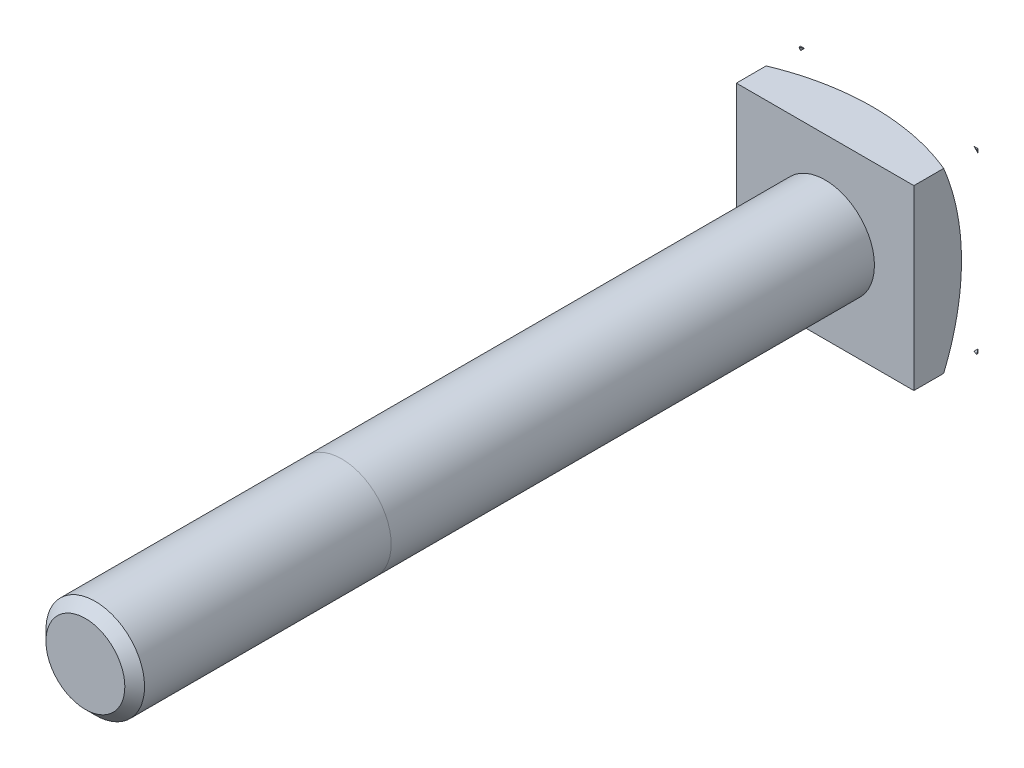
ISO-10303-21;
HEADER;
FILE_DESCRIPTION(('STEP AP214'),'2;1');
FILE_NAME('part.step','',(''),(''),'','','');
FILE_SCHEMA(('AUTOMOTIVE_DESIGN { 1 0 10303 214 1 1 1 1 }'));
ENDSEC;
DATA;
#1=APPLICATION_CONTEXT('core data for automotive mechanical design processes');
#2=APPLICATION_PROTOCOL_DEFINITION('international standard','automotive_design',2000,#1);
#3=PRODUCT_CONTEXT('',#1,'mechanical');
#4=PRODUCT('Part','Part','',(#3));
#5=PRODUCT_RELATED_PRODUCT_CATEGORY('part','',(#4));
#6=PRODUCT_DEFINITION_FORMATION('','',#4);
#7=PRODUCT_DEFINITION_CONTEXT('part definition',#1,'design');
#8=PRODUCT_DEFINITION('design','',#6,#7);
#9=PRODUCT_DEFINITION_SHAPE('','',#8);
#10=(LENGTH_UNIT() NAMED_UNIT(*) SI_UNIT(.MILLI.,.METRE.));
#11=(NAMED_UNIT(*) PLANE_ANGLE_UNIT() SI_UNIT($,.RADIAN.));
#12=(NAMED_UNIT(*) SI_UNIT($,.STERADIAN.) SOLID_ANGLE_UNIT());
#13=UNCERTAINTY_MEASURE_WITH_UNIT(LENGTH_MEASURE(1.E-05),#10,'distance_accuracy_value','');
#14=(GEOMETRIC_REPRESENTATION_CONTEXT(3) GLOBAL_UNCERTAINTY_ASSIGNED_CONTEXT((#13)) GLOBAL_UNIT_ASSIGNED_CONTEXT((#10,
#11,#12)) REPRESENTATION_CONTEXT('',''));
#15=CARTESIAN_POINT('',(0.,0.,0.));
#16=DIRECTION('',(0.,0.,1.));
#17=DIRECTION('',(1.,0.,0.));
#18=AXIS2_PLACEMENT_3D('',#15,#16,#17);
#19=CARTESIAN_POINT('',(0.,0.,78.25));
#20=DIRECTION('',(0.,0.,-1.));
#21=DIRECTION('',(-1.,0.,0.));
#22=AXIS2_PLACEMENT_3D('',#19,#20,#21);
#23=CYLINDRICAL_SURFACE('',#22,5.);
#24=CARTESIAN_POINT('',(0.,0.,77.25));
#25=DIRECTION('',(0.,0.,1.));
#26=DIRECTION('',(1.,0.,0.));
#27=AXIS2_PLACEMENT_3D('',#24,#25,#26);
#28=CIRCLE('',#27,5.);
#29=CARTESIAN_POINT('',(5.,0.,77.25));
#30=VERTEX_POINT('',#29);
#31=EDGE_CURVE('E12',#30,#30,#28,.F.);
#32=ORIENTED_EDGE('',*,*,#31,.T.);
#33=EDGE_LOOP('',(#32));
#34=FACE_BOUND('',#33,.T.);
#35=CARTESIAN_POINT('',(0.,0.,52.25));
#36=DIRECTION('',(0.,0.,-1.));
#37=DIRECTION('',(-1.,0.,0.));
#38=AXIS2_PLACEMENT_3D('',#35,#36,#37);
#39=CIRCLE('',#38,5.);
#40=CARTESIAN_POINT('',(-5.,0.,52.25));
#41=VERTEX_POINT('',#40);
#42=CARTESIAN_POINT('',(5.,0.,52.25));
#43=VERTEX_POINT('',#42);
#44=EDGE_CURVE('E74',#41,#43,#39,.T.);
#45=ORIENTED_EDGE('',*,*,#44,.F.);
#46=EDGE_CURVE('E147',#43,#41,#39,.T.);
#47=ORIENTED_EDGE('',*,*,#46,.F.);
#48=EDGE_LOOP('',(#45,#47));
#49=FACE_BOUND('',#48,.T.);
#50=ADVANCED_FACE('F58',(#34,#49),#23,.T.);
#51=CARTESIAN_POINT('',(9.,9.,3.25));
#52=DIRECTION('',(-1.,0.,0.));
#53=DIRECTION('',(0.,-1.,0.));
#54=AXIS2_PLACEMENT_3D('',#51,#52,#53);
#55=PLANE('',#54);
#56=DIRECTION('',(0.,0.,-1.));
#57=VECTOR('',#56,1.);
#58=CARTESIAN_POINT('',(9.,-9.,3.25));
#59=LINE('',#58,#57);
#60=CARTESIAN_POINT('',(9.,-9.,3.25));
#61=VERTEX_POINT('',#60);
#62=CARTESIAN_POINT('',(9.,-9.,0.23256520864998));
#63=VERTEX_POINT('',#62);
#64=EDGE_CURVE('E123',#61,#63,#59,.T.);
#65=ORIENTED_EDGE('',*,*,#64,.T.);
#66=CARTESIAN_POINT('',(9.,0.,21.75));
#67=DIRECTION('',(-1.,0.,0.));
#68=DIRECTION('',(0.,-1.,0.));
#69=AXIS2_PLACEMENT_3D('',#66,#67,#68);
#70=CIRCLE('',#69,23.3238075793812);
#71=CARTESIAN_POINT('',(8.99999999999999,8.99999999999999,0.232565208649976));
#72=VERTEX_POINT('',#71);
#73=EDGE_CURVE('E129',#63,#72,#70,.F.);
#74=ORIENTED_EDGE('',*,*,#73,.T.);
#75=DIRECTION('',(0.,0.,-1.));
#76=VECTOR('',#75,1.);
#77=CARTESIAN_POINT('',(9.,9.,3.25));
#78=LINE('',#77,#76);
#79=CARTESIAN_POINT('',(9.,9.,3.25));
#80=VERTEX_POINT('',#79);
#81=EDGE_CURVE('E133',#80,#72,#78,.T.);
#82=ORIENTED_EDGE('',*,*,#81,.F.);
#83=DIRECTION('',(0.,1.,0.));
#84=VECTOR('',#83,1.);
#85=CARTESIAN_POINT('',(9.,9.,3.25));
#86=LINE('',#85,#84);
#87=EDGE_CURVE('E111',#61,#80,#86,.T.);
#88=ORIENTED_EDGE('',*,*,#87,.F.);
#89=EDGE_LOOP('',(#65,#74,#82,#88));
#90=FACE_BOUND('',#89,.T.);
#91=ADVANCED_FACE('F131',(#90),#55,.F.);
#92=CARTESIAN_POINT('',(-9.,9.,3.25));
#93=DIRECTION('',(0.,-1.,0.));
#94=DIRECTION('',(0.,0.,-1.));
#95=AXIS2_PLACEMENT_3D('',#92,#93,#94);
#96=PLANE('',#95);
#97=ORIENTED_EDGE('',*,*,#81,.T.);
#98=CARTESIAN_POINT('',(0.,8.99999999999999,21.75));
#99=DIRECTION('',(0.,-1.,0.));
#100=DIRECTION('',(0.,0.,-1.));
#101=AXIS2_PLACEMENT_3D('',#98,#99,#100);
#102=CIRCLE('',#101,23.3238075793812);
#103=CARTESIAN_POINT('',(-9.,8.99999999999999,0.232565208649983));
#104=VERTEX_POINT('',#103);
#105=EDGE_CURVE('E150',#72,#104,#102,.F.);
#106=ORIENTED_EDGE('',*,*,#105,.T.);
#107=DIRECTION('',(0.,0.,-1.));
#108=VECTOR('',#107,1.);
#109=CARTESIAN_POINT('',(-9.,9.,3.25));
#110=LINE('',#109,#108);
#111=CARTESIAN_POINT('',(-9.,9.,3.25));
#112=VERTEX_POINT('',#111);
#113=EDGE_CURVE('E154',#112,#104,#110,.T.);
#114=ORIENTED_EDGE('',*,*,#113,.F.);
#115=DIRECTION('',(-1.,0.,0.));
#116=VECTOR('',#115,1.);
#117=CARTESIAN_POINT('',(-9.,9.,3.25));
#118=LINE('',#117,#116);
#119=EDGE_CURVE('E135',#80,#112,#118,.T.);
#120=ORIENTED_EDGE('',*,*,#119,.F.);
#121=EDGE_LOOP('',(#97,#106,#114,#120));
#122=FACE_BOUND('',#121,.T.);
#123=ADVANCED_FACE('F197',(#122),#96,.F.);
#124=CARTESIAN_POINT('',(-9.,9.,3.25));
#125=DIRECTION('',(1.,0.,0.));
#126=DIRECTION('',(0.,0.,-1.));
#127=AXIS2_PLACEMENT_3D('',#124,#125,#126);
#128=PLANE('',#127);
#129=ORIENTED_EDGE('',*,*,#113,.T.);
#130=CARTESIAN_POINT('',(-9.,0.,21.75));
#131=DIRECTION('',(1.,0.,0.));
#132=DIRECTION('',(0.,0.,-1.));
#133=AXIS2_PLACEMENT_3D('',#130,#131,#132);
#134=CIRCLE('',#133,23.3238075793812);
#135=CARTESIAN_POINT('',(-9.,-9.,0.23256520864998));
#136=VERTEX_POINT('',#135);
#137=EDGE_CURVE('E155',#104,#136,#134,.F.);
#138=ORIENTED_EDGE('',*,*,#137,.T.);
#139=DIRECTION('',(0.,0.,-1.));
#140=VECTOR('',#139,1.);
#141=CARTESIAN_POINT('',(-9.,-9.,3.25));
#142=LINE('',#141,#140);
#143=CARTESIAN_POINT('',(-9.,-9.,3.25));
#144=VERTEX_POINT('',#143);
#145=EDGE_CURVE('E140',#144,#136,#142,.T.);
#146=ORIENTED_EDGE('',*,*,#145,.F.);
#147=DIRECTION('',(0.,-1.,0.));
#148=VECTOR('',#147,1.);
#149=CARTESIAN_POINT('',(-9.,9.,3.25));
#150=LINE('',#149,#148);
#151=EDGE_CURVE('E114',#112,#144,#150,.T.);
#152=ORIENTED_EDGE('',*,*,#151,.F.);
#153=EDGE_LOOP('',(#129,#138,#146,#152));
#154=FACE_BOUND('',#153,.T.);
#155=ADVANCED_FACE('F211',(#154),#128,.F.);
#156=CARTESIAN_POINT('',(-9.,-9.,3.25));
#157=DIRECTION('',(0.,1.,0.));
#158=DIRECTION('',(0.,0.,1.));
#159=AXIS2_PLACEMENT_3D('',#156,#157,#158);
#160=PLANE('',#159);
#161=ORIENTED_EDGE('',*,*,#145,.T.);
#162=CARTESIAN_POINT('',(0.,-9.,21.75));
#163=DIRECTION('',(0.,1.,0.));
#164=DIRECTION('',(0.,0.,1.));
#165=AXIS2_PLACEMENT_3D('',#162,#163,#164);
#166=CIRCLE('',#165,23.3238075793812);
#167=EDGE_CURVE('E125',#136,#63,#166,.F.);
#168=ORIENTED_EDGE('',*,*,#167,.T.);
#169=ORIENTED_EDGE('',*,*,#64,.F.);
#170=DIRECTION('',(1.,0.,0.));
#171=VECTOR('',#170,1.);
#172=CARTESIAN_POINT('',(-9.,-9.,3.25));
#173=LINE('',#172,#171);
#174=EDGE_CURVE('E107',#144,#61,#173,.T.);
#175=ORIENTED_EDGE('',*,*,#174,.F.);
#176=EDGE_LOOP('',(#161,#168,#169,#175));
#177=FACE_BOUND('',#176,.T.);
#178=ADVANCED_FACE('F124',(#177),#160,.F.);
#179=CARTESIAN_POINT('',(0.,0.,3.25));
#180=DIRECTION('',(0.,0.,1.));
#181=DIRECTION('',(1.,0.,0.));
#182=AXIS2_PLACEMENT_3D('',#179,#180,#181);
#183=PLANE('',#182);
#184=CARTESIAN_POINT('',(0.,0.,3.25));
#185=DIRECTION('',(0.,0.,1.));
#186=DIRECTION('',(1.,0.,0.));
#187=AXIS2_PLACEMENT_3D('',#184,#185,#186);
#188=CIRCLE('',#187,5.);
#189=CARTESIAN_POINT('',(5.,0.,3.25));
#190=VERTEX_POINT('',#189);
#191=EDGE_CURVE('E119',#190,#190,#188,.T.);
#192=ORIENTED_EDGE('',*,*,#191,.F.);
#193=EDGE_LOOP('',(#192));
#194=FACE_BOUND('',#193,.T.);
#195=ORIENTED_EDGE('',*,*,#87,.T.);
#196=ORIENTED_EDGE('',*,*,#119,.T.);
#197=ORIENTED_EDGE('',*,*,#151,.T.);
#198=ORIENTED_EDGE('',*,*,#174,.T.);
#199=EDGE_LOOP('',(#195,#196,#197,#198));
#200=FACE_BOUND('',#199,.T.);
#201=ADVANCED_FACE('F109',(#194,#200),#183,.T.);
#202=ORIENTED_EDGE('',*,*,#46,.T.);
#203=ORIENTED_EDGE('',*,*,#44,.T.);
#204=EDGE_LOOP('',(#202,#203));
#205=FACE_BOUND('',#204,.T.);
#206=ORIENTED_EDGE('',*,*,#191,.T.);
#207=EDGE_LOOP('',(#206));
#208=FACE_BOUND('',#207,.T.);
#209=ADVANCED_FACE('F193',(#205,#208),#23,.T.);
#210=CARTESIAN_POINT('',(0.,0.,78.25));
#211=DIRECTION('',(0.,0.,1.));
#212=DIRECTION('',(1.,0.,0.));
#213=AXIS2_PLACEMENT_3D('',#210,#211,#212);
#214=PLANE('',#213);
#215=CARTESIAN_POINT('',(0.,0.,78.25));
#216=DIRECTION('',(0.,0.,1.));
#217=DIRECTION('',(1.,0.,0.));
#218=AXIS2_PLACEMENT_3D('',#215,#216,#217);
#219=CIRCLE('',#218,4.);
#220=CARTESIAN_POINT('',(4.,0.,78.25));
#221=VERTEX_POINT('',#220);
#222=EDGE_CURVE('E68',#221,#221,#219,.T.);
#223=ORIENTED_EDGE('',*,*,#222,.T.);
#224=EDGE_LOOP('',(#223));
#225=FACE_BOUND('',#224,.T.);
#226=ADVANCED_FACE('F179',(#225),#214,.T.);
#227=CARTESIAN_POINT('',(0.,0.,21.75));
#228=DIRECTION('',(0.,0.,1.));
#229=DIRECTION('',(1.,0.,0.));
#230=AXIS2_PLACEMENT_3D('',#227,#228,#229);
#231=SPHERICAL_SURFACE('',#230,25.);
#232=CARTESIAN_POINT('',(0.,0.,-3.25));
#233=VERTEX_POINT('',#232);
#234=VERTEX_LOOP('',#233);
#235=FACE_BOUND('',#234,.T.);
#236=ORIENTED_EDGE('',*,*,#167,.F.);
#237=ORIENTED_EDGE('',*,*,#137,.F.);
#238=ORIENTED_EDGE('',*,*,#105,.F.);
#239=ORIENTED_EDGE('',*,*,#73,.F.);
#240=EDGE_LOOP('',(#236,#237,#238,#239));
#241=FACE_BOUND('',#240,.T.);
#242=ADVANCED_FACE('F182',(#235,#241),#231,.T.);
#243=CARTESIAN_POINT('',(0.,0.,78.25));
#244=DIRECTION('',(0.,0.,-1.));
#245=DIRECTION('',(-1.,0.,0.));
#246=AXIS2_PLACEMENT_3D('',#243,#244,#245);
#247=CONICAL_SURFACE('',#246,4.,0.78539816339745);
#248=ORIENTED_EDGE('',*,*,#31,.F.);
#249=EDGE_LOOP('',(#248));
#250=FACE_BOUND('',#249,.T.);
#251=ORIENTED_EDGE('',*,*,#222,.F.);
#252=EDGE_LOOP('',(#251));
#253=FACE_BOUND('',#252,.T.);
#254=ADVANCED_FACE('F61',(#250,#253),#247,.T.);
#255=CLOSED_SHELL('',(#50,#91,#123,#155,#178,#201,#209,#226,#242,#254));
#256=MANIFOLD_SOLID_BREP('B2',#255);
#257=CARTESIAN_POINT('',(0.,0.,-3.25));
#258=DIRECTION('',(0.,0.,1.));
#259=DIRECTION('',(1.,0.,0.));
#260=AXIS2_PLACEMENT_3D('',#257,#258,#259);
#261=PLANE('',#260);
#262=DIRECTION('',(1.,0.,0.));
#263=VECTOR('',#262,1.);
#264=CARTESIAN_POINT('',(-9.,-9.,-3.25));
#265=LINE('',#264,#263);
#266=CARTESIAN_POINT('',(8.58362564030792,-9.,-3.25));
#267=VERTEX_POINT('',#266);
#268=CARTESIAN_POINT('',(9.,-9.,-3.25));
#269=VERTEX_POINT('',#268);
#270=EDGE_CURVE('E346',#267,#269,#265,.T.);
#271=ORIENTED_EDGE('',*,*,#270,.F.);
#272=CARTESIAN_POINT('',(0.,0.,-3.25));
#273=DIRECTION('',(0.,0.,1.));
#274=DIRECTION('',(1.,0.,0.));
#275=AXIS2_PLACEMENT_3D('',#272,#273,#274);
#276=CIRCLE('',#275,12.4369863364463);
#277=CARTESIAN_POINT('',(9.,-8.58362564030792,-3.25));
#278=VERTEX_POINT('',#277);
#279=EDGE_CURVE('E338',#267,#278,#276,.T.);
#280=ORIENTED_EDGE('',*,*,#279,.T.);
#281=DIRECTION('',(0.,1.,0.));
#282=VECTOR('',#281,1.);
#283=CARTESIAN_POINT('',(9.,9.,-3.25));
#284=LINE('',#283,#282);
#285=EDGE_CURVE('E348',#269,#278,#284,.T.);
#286=ORIENTED_EDGE('',*,*,#285,.F.);
#287=EDGE_LOOP('',(#271,#280,#286));
#288=FACE_BOUND('',#287,.T.);
#289=ADVANCED_FACE('F314',(#288),#261,.F.);
#290=CARTESIAN_POINT('',(-9.,-9.,3.25));
#291=DIRECTION('',(0.,1.,0.));
#292=DIRECTION('',(0.,0.,1.));
#293=AXIS2_PLACEMENT_3D('',#290,#291,#292);
#294=PLANE('',#293);
#295=DIRECTION('',(0.,0.,-1.));
#296=VECTOR('',#295,1.);
#297=CARTESIAN_POINT('',(9.,-9.,3.25));
#298=LINE('',#297,#296);
#299=CARTESIAN_POINT('',(9.,-9.,-3.10314123270842));
#300=VERTEX_POINT('',#299);
#301=EDGE_CURVE('E56',#300,#269,#298,.T.);
#302=ORIENTED_EDGE('',*,*,#301,.F.);
#303=CARTESIAN_POINT('',(0.,-9.,21.75));
#304=DIRECTION('',(0.,1.,0.));
#305=DIRECTION('',(0.,0.,1.));
#306=AXIS2_PLACEMENT_3D('',#303,#304,#305);
#307=CIRCLE('',#306,26.4325297528056);
#308=EDGE_CURVE('E340',#300,#267,#307,.T.);
#309=ORIENTED_EDGE('',*,*,#308,.T.);
#310=ORIENTED_EDGE('',*,*,#270,.T.);
#311=EDGE_LOOP('',(#302,#309,#310));
#312=FACE_BOUND('',#311,.T.);
#313=ADVANCED_FACE('F345',(#312),#294,.F.);
#314=CARTESIAN_POINT('',(9.,9.,3.25));
#315=DIRECTION('',(-1.,0.,0.));
#316=DIRECTION('',(0.,-1.,0.));
#317=AXIS2_PLACEMENT_3D('',#314,#315,#316);
#318=PLANE('',#317);
#319=ORIENTED_EDGE('',*,*,#285,.T.);
#320=CARTESIAN_POINT('',(9.,0.,21.75));
#321=DIRECTION('',(-1.,0.,0.));
#322=DIRECTION('',(0.,-1.,0.));
#323=AXIS2_PLACEMENT_3D('',#320,#321,#322);
#324=CIRCLE('',#323,26.4325297528056);
#325=EDGE_CURVE('E323',#278,#300,#324,.T.);
#326=ORIENTED_EDGE('',*,*,#325,.T.);
#327=ORIENTED_EDGE('',*,*,#301,.T.);
#328=EDGE_LOOP('',(#319,#326,#327));
#329=FACE_BOUND('',#328,.T.);
#330=ADVANCED_FACE('F352',(#329),#318,.F.);
#331=CARTESIAN_POINT('',(0.,0.,21.75));
#332=DIRECTION('',(0.,0.,1.));
#333=DIRECTION('',(1.,0.,0.));
#334=AXIS2_PLACEMENT_3D('',#331,#332,#333);
#335=SPHERICAL_SURFACE('',#334,27.9227260333398);
#336=ORIENTED_EDGE('',*,*,#279,.F.);
#337=ORIENTED_EDGE('',*,*,#308,.F.);
#338=ORIENTED_EDGE('',*,*,#325,.F.);
#339=EDGE_LOOP('',(#336,#337,#338));
#340=FACE_BOUND('',#339,.T.);
#341=ADVANCED_FACE('F316',(#340),#335,.F.);
#342=CLOSED_SHELL('',(#289,#313,#330,#341));
#343=MANIFOLD_SOLID_BREP('B6',#342);
#344=CARTESIAN_POINT('',(0.,0.,-3.25));
#345=DIRECTION('',(0.,0.,1.));
#346=DIRECTION('',(1.,0.,0.));
#347=AXIS2_PLACEMENT_3D('',#344,#345,#346);
#348=PLANE('',#347);
#349=DIRECTION('',(0.,-1.,0.));
#350=VECTOR('',#349,1.);
#351=CARTESIAN_POINT('',(-9.,9.,-3.25));
#352=LINE('',#351,#350);
#353=CARTESIAN_POINT('',(-9.,-8.58362564030792,-3.25));
#354=VERTEX_POINT('',#353);
#355=CARTESIAN_POINT('',(-9.,-9.,-3.25));
#356=VERTEX_POINT('',#355);
#357=EDGE_CURVE('E312',#354,#356,#352,.T.);
#358=ORIENTED_EDGE('',*,*,#357,.F.);
#359=CARTESIAN_POINT('',(0.,0.,-3.25));
#360=DIRECTION('',(0.,0.,1.));
#361=DIRECTION('',(1.,0.,0.));
#362=AXIS2_PLACEMENT_3D('',#359,#360,#361);
#363=CIRCLE('',#362,12.4369863364463);
#364=CARTESIAN_POINT('',(-8.58362564030792,-9.,-3.25));
#365=VERTEX_POINT('',#364);
#366=EDGE_CURVE('E408',#354,#365,#363,.T.);
#367=ORIENTED_EDGE('',*,*,#366,.T.);
#368=DIRECTION('',(1.,0.,0.));
#369=VECTOR('',#368,1.);
#370=CARTESIAN_POINT('',(-9.,-9.,-3.25));
#371=LINE('',#370,#369);
#372=EDGE_CURVE('E433',#356,#365,#371,.T.);
#373=ORIENTED_EDGE('',*,*,#372,.F.);
#374=EDGE_LOOP('',(#358,#367,#373));
#375=FACE_BOUND('',#374,.T.);
#376=ADVANCED_FACE('F404',(#375),#348,.F.);
#377=CARTESIAN_POINT('',(-9.,-9.,3.25));
#378=DIRECTION('',(0.,1.,0.));
#379=DIRECTION('',(0.,0.,1.));
#380=AXIS2_PLACEMENT_3D('',#377,#378,#379);
#381=PLANE('',#380);
#382=ORIENTED_EDGE('',*,*,#372,.T.);
#383=CARTESIAN_POINT('',(0.,-9.,21.75));
#384=DIRECTION('',(0.,1.,0.));
#385=DIRECTION('',(0.,0.,1.));
#386=AXIS2_PLACEMENT_3D('',#383,#384,#385);
#387=CIRCLE('',#386,26.4325297528056);
#388=CARTESIAN_POINT('',(-9.,-9.,-3.10314123270842));
#389=VERTEX_POINT('',#388);
#390=EDGE_CURVE('E427',#365,#389,#387,.T.);
#391=ORIENTED_EDGE('',*,*,#390,.T.);
#392=DIRECTION('',(0.,0.,-1.));
#393=VECTOR('',#392,1.);
#394=CARTESIAN_POINT('',(-9.,-9.,3.25));
#395=LINE('',#394,#393);
#396=EDGE_CURVE('E432',#389,#356,#395,.T.);
#397=ORIENTED_EDGE('',*,*,#396,.T.);
#398=EDGE_LOOP('',(#382,#391,#397));
#399=FACE_BOUND('',#398,.T.);
#400=ADVANCED_FACE('F437',(#399),#381,.F.);
#401=CARTESIAN_POINT('',(-9.,9.,3.25));
#402=DIRECTION('',(1.,0.,0.));
#403=DIRECTION('',(0.,0.,-1.));
#404=AXIS2_PLACEMENT_3D('',#401,#402,#403);
#405=PLANE('',#404);
#406=ORIENTED_EDGE('',*,*,#396,.F.);
#407=CARTESIAN_POINT('',(-9.,0.,21.75));
#408=DIRECTION('',(1.,0.,0.));
#409=DIRECTION('',(0.,0.,-1.));
#410=AXIS2_PLACEMENT_3D('',#407,#408,#409);
#411=CIRCLE('',#410,26.4325297528056);
#412=EDGE_CURVE('E414',#389,#354,#411,.T.);
#413=ORIENTED_EDGE('',*,*,#412,.T.);
#414=ORIENTED_EDGE('',*,*,#357,.T.);
#415=EDGE_LOOP('',(#406,#413,#414));
#416=FACE_BOUND('',#415,.T.);
#417=ADVANCED_FACE('F442',(#416),#405,.F.);
#418=CARTESIAN_POINT('',(0.,0.,21.75));
#419=DIRECTION('',(0.,0.,1.));
#420=DIRECTION('',(1.,0.,0.));
#421=AXIS2_PLACEMENT_3D('',#418,#419,#420);
#422=SPHERICAL_SURFACE('',#421,27.9227260333398);
#423=ORIENTED_EDGE('',*,*,#390,.F.);
#424=ORIENTED_EDGE('',*,*,#366,.F.);
#425=ORIENTED_EDGE('',*,*,#412,.F.);
#426=EDGE_LOOP('',(#423,#424,#425));
#427=FACE_BOUND('',#426,.T.);
#428=ADVANCED_FACE('F406',(#427),#422,.F.);
#429=CLOSED_SHELL('',(#376,#400,#417,#428));
#430=MANIFOLD_SOLID_BREP('B50',#429);
#431=CARTESIAN_POINT('',(0.,0.,-3.25));
#432=DIRECTION('',(0.,0.,1.));
#433=DIRECTION('',(1.,0.,0.));
#434=AXIS2_PLACEMENT_3D('',#431,#432,#433);
#435=PLANE('',#434);
#436=DIRECTION('',(-1.,0.,0.));
#437=VECTOR('',#436,1.);
#438=CARTESIAN_POINT('',(-9.,9.,-3.25));
#439=LINE('',#438,#437);
#440=CARTESIAN_POINT('',(-8.58362564030792,9.,-3.25));
#441=VERTEX_POINT('',#440);
#442=CARTESIAN_POINT('',(-9.,9.,-3.25));
#443=VERTEX_POINT('',#442);
#444=EDGE_CURVE('E402',#441,#443,#439,.T.);
#445=ORIENTED_EDGE('',*,*,#444,.F.);
#446=CARTESIAN_POINT('',(0.,0.,-3.25));
#447=DIRECTION('',(0.,0.,1.));
#448=DIRECTION('',(1.,0.,0.));
#449=AXIS2_PLACEMENT_3D('',#446,#447,#448);
#450=CIRCLE('',#449,12.4369863364463);
#451=CARTESIAN_POINT('',(-9.,8.58362564030792,-3.25));
#452=VERTEX_POINT('',#451);
#453=EDGE_CURVE('E496',#441,#452,#450,.T.);
#454=ORIENTED_EDGE('',*,*,#453,.T.);
#455=DIRECTION('',(0.,-1.,0.));
#456=VECTOR('',#455,1.);
#457=CARTESIAN_POINT('',(-9.,9.,-3.25));
#458=LINE('',#457,#456);
#459=EDGE_CURVE('E522',#443,#452,#458,.T.);
#460=ORIENTED_EDGE('',*,*,#459,.F.);
#461=EDGE_LOOP('',(#445,#454,#460));
#462=FACE_BOUND('',#461,.T.);
#463=ADVANCED_FACE('F493',(#462),#435,.F.);
#464=CARTESIAN_POINT('',(-9.,9.,3.25));
#465=DIRECTION('',(1.,0.,0.));
#466=DIRECTION('',(0.,0.,-1.));
#467=AXIS2_PLACEMENT_3D('',#464,#465,#466);
#468=PLANE('',#467);
#469=ORIENTED_EDGE('',*,*,#459,.T.);
#470=CARTESIAN_POINT('',(-9.,0.,21.75));
#471=DIRECTION('',(1.,0.,0.));
#472=DIRECTION('',(0.,0.,-1.));
#473=AXIS2_PLACEMENT_3D('',#470,#471,#472);
#474=CIRCLE('',#473,26.4325297528056);
#475=CARTESIAN_POINT('',(-9.,8.99999999999999,-3.10314123270842));
#476=VERTEX_POINT('',#475);
#477=EDGE_CURVE('E515',#452,#476,#474,.T.);
#478=ORIENTED_EDGE('',*,*,#477,.T.);
#479=DIRECTION('',(0.,0.,-1.));
#480=VECTOR('',#479,1.);
#481=CARTESIAN_POINT('',(-9.,9.,3.25));
#482=LINE('',#481,#480);
#483=EDGE_CURVE('E521',#476,#443,#482,.T.);
#484=ORIENTED_EDGE('',*,*,#483,.T.);
#485=EDGE_LOOP('',(#469,#478,#484));
#486=FACE_BOUND('',#485,.T.);
#487=ADVANCED_FACE('F526',(#486),#468,.F.);
#488=CARTESIAN_POINT('',(-9.,9.,3.25));
#489=DIRECTION('',(0.,-1.,0.));
#490=DIRECTION('',(0.,0.,-1.));
#491=AXIS2_PLACEMENT_3D('',#488,#489,#490);
#492=PLANE('',#491);
#493=ORIENTED_EDGE('',*,*,#483,.F.);
#494=CARTESIAN_POINT('',(0.,8.99999999999999,21.75));
#495=DIRECTION('',(0.,-1.,0.));
#496=DIRECTION('',(0.,0.,-1.));
#497=AXIS2_PLACEMENT_3D('',#494,#495,#496);
#498=CIRCLE('',#497,26.4325297528056);
#499=EDGE_CURVE('E502',#476,#441,#498,.T.);
#500=ORIENTED_EDGE('',*,*,#499,.T.);
#501=ORIENTED_EDGE('',*,*,#444,.T.);
#502=EDGE_LOOP('',(#493,#500,#501));
#503=FACE_BOUND('',#502,.T.);
#504=ADVANCED_FACE('F531',(#503),#492,.F.);
#505=CARTESIAN_POINT('',(0.,0.,21.75));
#506=DIRECTION('',(0.,0.,1.));
#507=DIRECTION('',(1.,0.,0.));
#508=AXIS2_PLACEMENT_3D('',#505,#506,#507);
#509=SPHERICAL_SURFACE('',#508,27.9227260333398);
#510=ORIENTED_EDGE('',*,*,#477,.F.);
#511=ORIENTED_EDGE('',*,*,#453,.F.);
#512=ORIENTED_EDGE('',*,*,#499,.F.);
#513=EDGE_LOOP('',(#510,#511,#512));
#514=FACE_BOUND('',#513,.T.);
#515=ADVANCED_FACE('F517',(#514),#509,.F.);
#516=CLOSED_SHELL('',(#463,#487,#504,#515));
#517=MANIFOLD_SOLID_BREP('B306',#516);
#518=CARTESIAN_POINT('',(0.,0.,-3.25));
#519=DIRECTION('',(0.,0.,1.));
#520=DIRECTION('',(1.,0.,0.));
#521=AXIS2_PLACEMENT_3D('',#518,#519,#520);
#522=PLANE('',#521);
#523=DIRECTION('',(0.,1.,0.));
#524=VECTOR('',#523,1.);
#525=CARTESIAN_POINT('',(9.,9.,-3.25));
#526=LINE('',#525,#524);
#527=CARTESIAN_POINT('',(9.,8.58362564030793,-3.25));
#528=VERTEX_POINT('',#527);
#529=CARTESIAN_POINT('',(9.,9.,-3.25));
#530=VERTEX_POINT('',#529);
#531=EDGE_CURVE('E605',#528,#530,#526,.T.);
#532=ORIENTED_EDGE('',*,*,#531,.F.);
#533=CARTESIAN_POINT('',(0.,0.,-3.25));
#534=DIRECTION('',(0.,0.,1.));
#535=DIRECTION('',(1.,0.,0.));
#536=AXIS2_PLACEMENT_3D('',#533,#534,#535);
#537=CIRCLE('',#536,12.4369863364463);
#538=CARTESIAN_POINT('',(8.58362564030793,9.,-3.25));
#539=VERTEX_POINT('',#538);
#540=EDGE_CURVE('E491',#528,#539,#537,.T.);
#541=ORIENTED_EDGE('',*,*,#540,.T.);
#542=DIRECTION('',(-1.,0.,0.));
#543=VECTOR('',#542,1.);
#544=CARTESIAN_POINT('',(-9.,9.,-3.25));
#545=LINE('',#544,#543);
#546=EDGE_CURVE('E607',#530,#539,#545,.T.);
#547=ORIENTED_EDGE('',*,*,#546,.F.);
#548=EDGE_LOOP('',(#532,#541,#547));
#549=FACE_BOUND('',#548,.T.);
#550=ADVANCED_FACE('F573',(#549),#522,.F.);
#551=CARTESIAN_POINT('',(-9.,9.,3.25));
#552=DIRECTION('',(0.,-1.,0.));
#553=DIRECTION('',(0.,0.,-1.));
#554=AXIS2_PLACEMENT_3D('',#551,#552,#553);
#555=PLANE('',#554);
#556=ORIENTED_EDGE('',*,*,#546,.T.);
#557=CARTESIAN_POINT('',(0.,8.99999999999999,21.75));
#558=DIRECTION('',(0.,-1.,0.));
#559=DIRECTION('',(0.,0.,-1.));
#560=AXIS2_PLACEMENT_3D('',#557,#558,#559);
#561=CIRCLE('',#560,26.4325297528056);
#562=CARTESIAN_POINT('',(8.99999999999999,8.99999999999999,-3.10314123270842));
#563=VERTEX_POINT('',#562);
#564=EDGE_CURVE('E588',#539,#563,#561,.T.);
#565=ORIENTED_EDGE('',*,*,#564,.T.);
#566=DIRECTION('',(0.,0.,-1.));
#567=VECTOR('',#566,1.);
#568=CARTESIAN_POINT('',(9.,9.,3.25));
#569=LINE('',#568,#567);
#570=EDGE_CURVE('E581',#563,#530,#569,.T.);
#571=ORIENTED_EDGE('',*,*,#570,.T.);
#572=EDGE_LOOP('',(#556,#565,#571));
#573=FACE_BOUND('',#572,.T.);
#574=ADVANCED_FACE('F611',(#573),#555,.F.);
#575=CARTESIAN_POINT('',(9.,9.,3.25));
#576=DIRECTION('',(-1.,0.,0.));
#577=DIRECTION('',(0.,-1.,0.));
#578=AXIS2_PLACEMENT_3D('',#575,#576,#577);
#579=PLANE('',#578);
#580=ORIENTED_EDGE('',*,*,#570,.F.);
#581=CARTESIAN_POINT('',(9.,0.,21.75));
#582=DIRECTION('',(-1.,0.,0.));
#583=DIRECTION('',(0.,-1.,0.));
#584=AXIS2_PLACEMENT_3D('',#581,#582,#583);
#585=CIRCLE('',#584,26.4325297528056);
#586=EDGE_CURVE('E600',#563,#528,#585,.T.);
#587=ORIENTED_EDGE('',*,*,#586,.T.);
#588=ORIENTED_EDGE('',*,*,#531,.T.);
#589=EDGE_LOOP('',(#580,#587,#588));
#590=FACE_BOUND('',#589,.T.);
#591=ADVANCED_FACE('F575',(#590),#579,.F.);
#592=CARTESIAN_POINT('',(0.,0.,21.75));
#593=DIRECTION('',(0.,0.,1.));
#594=DIRECTION('',(1.,0.,0.));
#595=AXIS2_PLACEMENT_3D('',#592,#593,#594);
#596=SPHERICAL_SURFACE('',#595,27.9227260333398);
#597=ORIENTED_EDGE('',*,*,#564,.F.);
#598=ORIENTED_EDGE('',*,*,#540,.F.);
#599=ORIENTED_EDGE('',*,*,#586,.F.);
#600=EDGE_LOOP('',(#597,#598,#599));
#601=FACE_BOUND('',#600,.T.);
#602=ADVANCED_FACE('F599',(#601),#596,.F.);
#603=CLOSED_SHELL('',(#550,#574,#591,#602));
#604=MANIFOLD_SOLID_BREP('B396',#603);
#605=ADVANCED_BREP_SHAPE_REPRESENTATION('',(#18,#256,#343,#430,#517,#604),#14);
#606=SHAPE_DEFINITION_REPRESENTATION(#9,#605);
ENDSEC;
END-ISO-10303-21;
